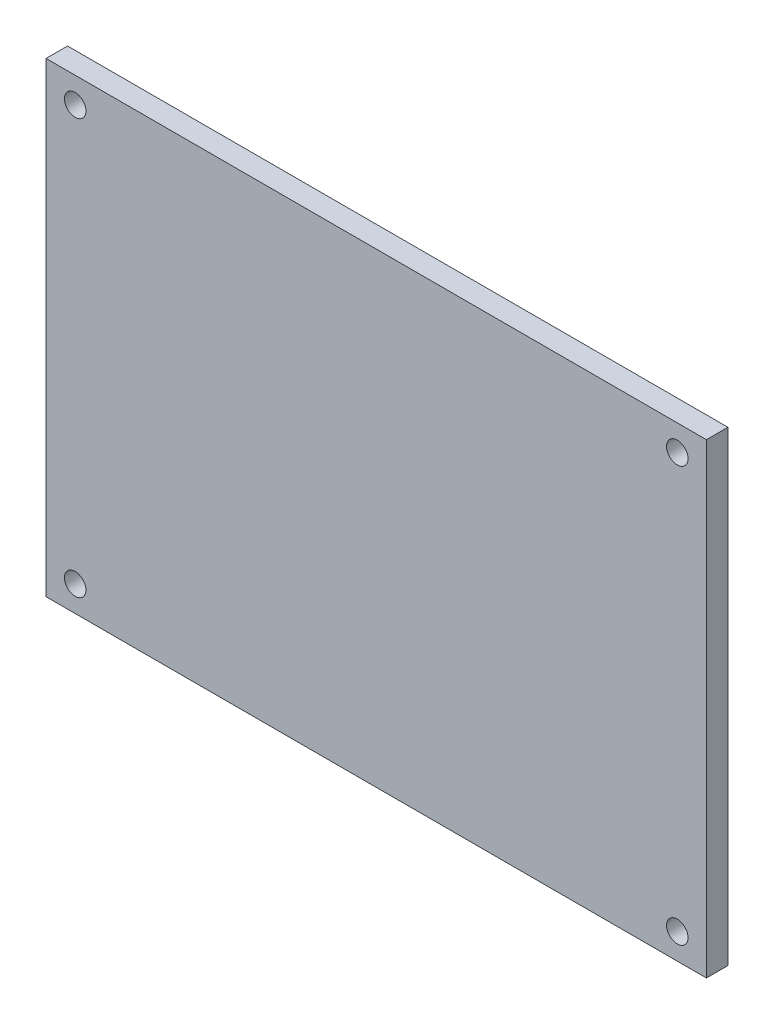
ISO-10303-21;
HEADER;
FILE_DESCRIPTION(('STEP AP214'),'2;1');
FILE_NAME('part.step','',(''),(''),'','','');
FILE_SCHEMA(('AUTOMOTIVE_DESIGN { 1 0 10303 214 1 1 1 1 }'));
ENDSEC;
DATA;
#1=APPLICATION_CONTEXT('core data for automotive mechanical design processes');
#2=APPLICATION_PROTOCOL_DEFINITION('international standard','automotive_design',2000,#1);
#3=PRODUCT_CONTEXT('',#1,'mechanical');
#4=PRODUCT('Part','Part','',(#3));
#5=PRODUCT_RELATED_PRODUCT_CATEGORY('part','',(#4));
#6=PRODUCT_DEFINITION_FORMATION('','',#4);
#7=PRODUCT_DEFINITION_CONTEXT('part definition',#1,'design');
#8=PRODUCT_DEFINITION('design','',#6,#7);
#9=PRODUCT_DEFINITION_SHAPE('','',#8);
#10=(LENGTH_UNIT() NAMED_UNIT(*) SI_UNIT(.MILLI.,.METRE.));
#11=(NAMED_UNIT(*) PLANE_ANGLE_UNIT() SI_UNIT($,.RADIAN.));
#12=(NAMED_UNIT(*) SI_UNIT($,.STERADIAN.) SOLID_ANGLE_UNIT());
#13=UNCERTAINTY_MEASURE_WITH_UNIT(LENGTH_MEASURE(1.E-05),#10,'distance_accuracy_value','');
#14=(GEOMETRIC_REPRESENTATION_CONTEXT(3) GLOBAL_UNCERTAINTY_ASSIGNED_CONTEXT((#13)) GLOBAL_UNIT_ASSIGNED_CONTEXT((#10,
#11,#12)) REPRESENTATION_CONTEXT('',''));
#15=CARTESIAN_POINT('',(0.,0.,0.));
#16=DIRECTION('',(0.,0.,1.));
#17=DIRECTION('',(1.,0.,0.));
#18=AXIS2_PLACEMENT_3D('',#15,#16,#17);
#19=CARTESIAN_POINT('',(0.,-32.5,3.));
#20=DIRECTION('',(0.,1.,0.));
#21=DIRECTION('',(0.,0.,1.));
#22=AXIS2_PLACEMENT_3D('',#19,#20,#21);
#23=PLANE('',#22);
#24=DIRECTION('',(1.,0.,0.));
#25=VECTOR('',#24,1.);
#26=CARTESIAN_POINT('',(0.,-32.5,0.));
#27=LINE('',#26,#25);
#28=CARTESIAN_POINT('',(-46.0375,-32.5,0.));
#29=VERTEX_POINT('',#28);
#30=CARTESIAN_POINT('',(46.0375,-32.5,0.));
#31=VERTEX_POINT('',#30);
#32=EDGE_CURVE('E113',#29,#31,#27,.T.);
#33=ORIENTED_EDGE('',*,*,#32,.T.);
#34=DIRECTION('',(0.,0.,-1.));
#35=VECTOR('',#34,1.);
#36=CARTESIAN_POINT('',(46.0375,-32.5,3.));
#37=LINE('',#36,#35);
#38=CARTESIAN_POINT('',(46.0375,-32.5,3.));
#39=VERTEX_POINT('',#38);
#40=EDGE_CURVE('E11',#39,#31,#37,.T.);
#41=ORIENTED_EDGE('',*,*,#40,.F.);
#42=DIRECTION('',(1.,0.,0.));
#43=VECTOR('',#42,1.);
#44=CARTESIAN_POINT('',(0.,-32.5,3.));
#45=LINE('',#44,#43);
#46=CARTESIAN_POINT('',(-46.0375,-32.5,3.));
#47=VERTEX_POINT('',#46);
#48=EDGE_CURVE('E87',#47,#39,#45,.T.);
#49=ORIENTED_EDGE('',*,*,#48,.F.);
#50=DIRECTION('',(0.,0.,-1.));
#51=VECTOR('',#50,1.);
#52=CARTESIAN_POINT('',(-46.0375,-32.5,3.));
#53=LINE('',#52,#51);
#54=EDGE_CURVE('E54',#47,#29,#53,.T.);
#55=ORIENTED_EDGE('',*,*,#54,.T.);
#56=EDGE_LOOP('',(#33,#41,#49,#55));
#57=FACE_BOUND('',#56,.T.);
#58=ADVANCED_FACE('F37',(#57),#23,.F.);
#59=CARTESIAN_POINT('',(46.0375,0.,3.));
#60=DIRECTION('',(-1.,0.,0.));
#61=DIRECTION('',(0.,0.,1.));
#62=AXIS2_PLACEMENT_3D('',#59,#60,#61);
#63=PLANE('',#62);
#64=DIRECTION('',(0.,1.,0.));
#65=VECTOR('',#64,1.);
#66=CARTESIAN_POINT('',(46.0375,0.,0.));
#67=LINE('',#66,#65);
#68=CARTESIAN_POINT('',(46.0375,32.5,0.));
#69=VERTEX_POINT('',#68);
#70=EDGE_CURVE('E92',#31,#69,#67,.T.);
#71=ORIENTED_EDGE('',*,*,#70,.T.);
#72=DIRECTION('',(0.,0.,-1.));
#73=VECTOR('',#72,1.);
#74=CARTESIAN_POINT('',(46.0375,32.5,3.));
#75=LINE('',#74,#73);
#76=CARTESIAN_POINT('',(46.0375,32.5,3.));
#77=VERTEX_POINT('',#76);
#78=EDGE_CURVE('E46',#77,#69,#75,.T.);
#79=ORIENTED_EDGE('',*,*,#78,.F.);
#80=DIRECTION('',(0.,1.,0.));
#81=VECTOR('',#80,1.);
#82=CARTESIAN_POINT('',(46.0375,0.,3.));
#83=LINE('',#82,#81);
#84=EDGE_CURVE('E79',#39,#77,#83,.T.);
#85=ORIENTED_EDGE('',*,*,#84,.F.);
#86=ORIENTED_EDGE('',*,*,#40,.T.);
#87=EDGE_LOOP('',(#71,#79,#85,#86));
#88=FACE_BOUND('',#87,.T.);
#89=ADVANCED_FACE('F91',(#88),#63,.F.);
#90=CARTESIAN_POINT('',(0.,32.5,3.));
#91=DIRECTION('',(0.,1.,0.));
#92=DIRECTION('',(0.,0.,1.));
#93=AXIS2_PLACEMENT_3D('',#90,#91,#92);
#94=PLANE('',#93);
#95=DIRECTION('',(1.,0.,0.));
#96=VECTOR('',#95,1.);
#97=CARTESIAN_POINT('',(0.,32.5,0.));
#98=LINE('',#97,#96);
#99=CARTESIAN_POINT('',(-46.0375,32.5,0.));
#100=VERTEX_POINT('',#99);
#101=EDGE_CURVE('E116',#100,#69,#98,.T.);
#102=ORIENTED_EDGE('',*,*,#101,.F.);
#103=DIRECTION('',(0.,0.,-1.));
#104=VECTOR('',#103,1.);
#105=CARTESIAN_POINT('',(-46.0375,32.5,3.));
#106=LINE('',#105,#104);
#107=CARTESIAN_POINT('',(-46.0375,32.5,3.));
#108=VERTEX_POINT('',#107);
#109=EDGE_CURVE('E68',#108,#100,#106,.T.);
#110=ORIENTED_EDGE('',*,*,#109,.F.);
#111=DIRECTION('',(1.,0.,0.));
#112=VECTOR('',#111,1.);
#113=CARTESIAN_POINT('',(0.,32.5,3.));
#114=LINE('',#113,#112);
#115=EDGE_CURVE('E86',#108,#77,#114,.T.);
#116=ORIENTED_EDGE('',*,*,#115,.T.);
#117=ORIENTED_EDGE('',*,*,#78,.T.);
#118=EDGE_LOOP('',(#102,#110,#116,#117));
#119=FACE_BOUND('',#118,.T.);
#120=ADVANCED_FACE('F95',(#119),#94,.T.);
#121=CARTESIAN_POINT('',(-41.9735,28.92,3.));
#122=DIRECTION('',(0.,0.,-1.));
#123=DIRECTION('',(-1.,0.,0.));
#124=AXIS2_PLACEMENT_3D('',#121,#122,#123);
#125=CYLINDRICAL_SURFACE('',#124,1.5);
#126=CARTESIAN_POINT('',(-41.9735,28.92,3.));
#127=DIRECTION('',(0.,0.,1.));
#128=DIRECTION('',(1.,0.,0.));
#129=AXIS2_PLACEMENT_3D('',#126,#127,#128);
#130=CIRCLE('',#129,1.5);
#131=CARTESIAN_POINT('',(-40.4735,28.92,3.));
#132=VERTEX_POINT('',#131);
#133=EDGE_CURVE('E135',#132,#132,#130,.T.);
#134=ORIENTED_EDGE('',*,*,#133,.T.);
#135=EDGE_LOOP('',(#134));
#136=FACE_BOUND('',#135,.T.);
#137=CARTESIAN_POINT('',(-41.9735,28.92,0.));
#138=DIRECTION('',(0.,0.,1.));
#139=DIRECTION('',(1.,0.,0.));
#140=AXIS2_PLACEMENT_3D('',#137,#138,#139);
#141=CIRCLE('',#140,1.5);
#142=CARTESIAN_POINT('',(-40.4735,28.92,0.));
#143=VERTEX_POINT('',#142);
#144=EDGE_CURVE('E110',#143,#143,#141,.T.);
#145=ORIENTED_EDGE('',*,*,#144,.F.);
#146=EDGE_LOOP('',(#145));
#147=FACE_BOUND('',#146,.T.);
#148=ADVANCED_FACE('F139',(#136,#147),#125,.F.);
#149=CARTESIAN_POINT('',(-41.9735,-28.92,3.));
#150=DIRECTION('',(0.,0.,-1.));
#151=DIRECTION('',(-1.,0.,0.));
#152=AXIS2_PLACEMENT_3D('',#149,#150,#151);
#153=CYLINDRICAL_SURFACE('',#152,1.5);
#154=CARTESIAN_POINT('',(-41.9735,-28.92,3.));
#155=DIRECTION('',(0.,0.,1.));
#156=DIRECTION('',(1.,0.,0.));
#157=AXIS2_PLACEMENT_3D('',#154,#155,#156);
#158=CIRCLE('',#157,1.5);
#159=CARTESIAN_POINT('',(-40.4735,-28.92,3.));
#160=VERTEX_POINT('',#159);
#161=EDGE_CURVE('E130',#160,#160,#158,.T.);
#162=ORIENTED_EDGE('',*,*,#161,.T.);
#163=EDGE_LOOP('',(#162));
#164=FACE_BOUND('',#163,.T.);
#165=CARTESIAN_POINT('',(-41.9735,-28.92,0.));
#166=DIRECTION('',(0.,0.,1.));
#167=DIRECTION('',(1.,0.,0.));
#168=AXIS2_PLACEMENT_3D('',#165,#166,#167);
#169=CIRCLE('',#168,1.5);
#170=CARTESIAN_POINT('',(-40.4735,-28.92,0.));
#171=VERTEX_POINT('',#170);
#172=EDGE_CURVE('E107',#171,#171,#169,.T.);
#173=ORIENTED_EDGE('',*,*,#172,.F.);
#174=EDGE_LOOP('',(#173));
#175=FACE_BOUND('',#174,.T.);
#176=ADVANCED_FACE('F165',(#164,#175),#153,.F.);
#177=CARTESIAN_POINT('',(41.9735,28.92,3.));
#178=DIRECTION('',(0.,0.,-1.));
#179=DIRECTION('',(-1.,0.,0.));
#180=AXIS2_PLACEMENT_3D('',#177,#178,#179);
#181=CYLINDRICAL_SURFACE('',#180,1.5);
#182=CARTESIAN_POINT('',(41.9735,28.92,3.));
#183=DIRECTION('',(0.,0.,1.));
#184=DIRECTION('',(1.,0.,0.));
#185=AXIS2_PLACEMENT_3D('',#182,#183,#184);
#186=CIRCLE('',#185,1.5);
#187=CARTESIAN_POINT('',(43.4735,28.92,3.));
#188=VERTEX_POINT('',#187);
#189=EDGE_CURVE('E125',#188,#188,#186,.T.);
#190=ORIENTED_EDGE('',*,*,#189,.T.);
#191=EDGE_LOOP('',(#190));
#192=FACE_BOUND('',#191,.T.);
#193=CARTESIAN_POINT('',(41.9735,28.92,0.));
#194=DIRECTION('',(0.,0.,1.));
#195=DIRECTION('',(1.,0.,0.));
#196=AXIS2_PLACEMENT_3D('',#193,#194,#195);
#197=CIRCLE('',#196,1.5);
#198=CARTESIAN_POINT('',(43.4735,28.92,0.));
#199=VERTEX_POINT('',#198);
#200=EDGE_CURVE('E104',#199,#199,#197,.T.);
#201=ORIENTED_EDGE('',*,*,#200,.F.);
#202=EDGE_LOOP('',(#201));
#203=FACE_BOUND('',#202,.T.);
#204=ADVANCED_FACE('F167',(#192,#203),#181,.F.);
#205=CARTESIAN_POINT('',(41.9735,-28.92,3.));
#206=DIRECTION('',(0.,0.,-1.));
#207=DIRECTION('',(-1.,0.,0.));
#208=AXIS2_PLACEMENT_3D('',#205,#206,#207);
#209=CYLINDRICAL_SURFACE('',#208,1.5);
#210=CARTESIAN_POINT('',(41.9735,-28.92,3.));
#211=DIRECTION('',(0.,0.,1.));
#212=DIRECTION('',(1.,0.,0.));
#213=AXIS2_PLACEMENT_3D('',#210,#211,#212);
#214=CIRCLE('',#213,1.5);
#215=CARTESIAN_POINT('',(43.4735,-28.92,3.));
#216=VERTEX_POINT('',#215);
#217=EDGE_CURVE('E121',#216,#216,#214,.T.);
#218=ORIENTED_EDGE('',*,*,#217,.T.);
#219=EDGE_LOOP('',(#218));
#220=FACE_BOUND('',#219,.T.);
#221=CARTESIAN_POINT('',(41.9735,-28.92,0.));
#222=DIRECTION('',(0.,0.,1.));
#223=DIRECTION('',(1.,0.,0.));
#224=AXIS2_PLACEMENT_3D('',#221,#222,#223);
#225=CIRCLE('',#224,1.5);
#226=CARTESIAN_POINT('',(43.4735,-28.92,0.));
#227=VERTEX_POINT('',#226);
#228=EDGE_CURVE('E101',#227,#227,#225,.T.);
#229=ORIENTED_EDGE('',*,*,#228,.F.);
#230=EDGE_LOOP('',(#229));
#231=FACE_BOUND('',#230,.T.);
#232=ADVANCED_FACE('F39',(#220,#231),#209,.F.);
#233=CARTESIAN_POINT('',(-46.0375,0.,3.));
#234=DIRECTION('',(-1.,0.,0.));
#235=DIRECTION('',(0.,0.,1.));
#236=AXIS2_PLACEMENT_3D('',#233,#234,#235);
#237=PLANE('',#236);
#238=DIRECTION('',(0.,1.,0.));
#239=VECTOR('',#238,1.);
#240=CARTESIAN_POINT('',(-46.0375,0.,0.));
#241=LINE('',#240,#239);
#242=EDGE_CURVE('E118',#29,#100,#241,.T.);
#243=ORIENTED_EDGE('',*,*,#242,.F.);
#244=ORIENTED_EDGE('',*,*,#54,.F.);
#245=DIRECTION('',(0.,1.,0.));
#246=VECTOR('',#245,1.);
#247=CARTESIAN_POINT('',(-46.0375,0.,3.));
#248=LINE('',#247,#246);
#249=EDGE_CURVE('E96',#47,#108,#248,.T.);
#250=ORIENTED_EDGE('',*,*,#249,.T.);
#251=ORIENTED_EDGE('',*,*,#109,.T.);
#252=EDGE_LOOP('',(#243,#244,#250,#251));
#253=FACE_BOUND('',#252,.T.);
#254=ADVANCED_FACE('F144',(#253),#237,.T.);
#255=CARTESIAN_POINT('',(0.,0.,3.));
#256=DIRECTION('',(0.,0.,1.));
#257=DIRECTION('',(1.,0.,0.));
#258=AXIS2_PLACEMENT_3D('',#255,#256,#257);
#259=PLANE('',#258);
#260=ORIENTED_EDGE('',*,*,#217,.F.);
#261=EDGE_LOOP('',(#260));
#262=FACE_BOUND('',#261,.T.);
#263=ORIENTED_EDGE('',*,*,#189,.F.);
#264=EDGE_LOOP('',(#263));
#265=FACE_BOUND('',#264,.T.);
#266=ORIENTED_EDGE('',*,*,#161,.F.);
#267=EDGE_LOOP('',(#266));
#268=FACE_BOUND('',#267,.T.);
#269=ORIENTED_EDGE('',*,*,#133,.F.);
#270=EDGE_LOOP('',(#269));
#271=FACE_BOUND('',#270,.T.);
#272=ORIENTED_EDGE('',*,*,#48,.T.);
#273=ORIENTED_EDGE('',*,*,#84,.T.);
#274=ORIENTED_EDGE('',*,*,#115,.F.);
#275=ORIENTED_EDGE('',*,*,#249,.F.);
#276=EDGE_LOOP('',(#272,#273,#274,#275));
#277=FACE_BOUND('',#276,.T.);
#278=ADVANCED_FACE('F83',(#262,#265,#268,#271,#277),#259,.T.);
#279=CARTESIAN_POINT('',(0.,0.,0.));
#280=DIRECTION('',(0.,0.,1.));
#281=DIRECTION('',(1.,0.,0.));
#282=AXIS2_PLACEMENT_3D('',#279,#280,#281);
#283=PLANE('',#282);
#284=ORIENTED_EDGE('',*,*,#228,.T.);
#285=EDGE_LOOP('',(#284));
#286=FACE_BOUND('',#285,.T.);
#287=ORIENTED_EDGE('',*,*,#200,.T.);
#288=EDGE_LOOP('',(#287));
#289=FACE_BOUND('',#288,.T.);
#290=ORIENTED_EDGE('',*,*,#172,.T.);
#291=EDGE_LOOP('',(#290));
#292=FACE_BOUND('',#291,.T.);
#293=ORIENTED_EDGE('',*,*,#144,.T.);
#294=EDGE_LOOP('',(#293));
#295=FACE_BOUND('',#294,.T.);
#296=ORIENTED_EDGE('',*,*,#32,.F.);
#297=ORIENTED_EDGE('',*,*,#242,.T.);
#298=ORIENTED_EDGE('',*,*,#101,.T.);
#299=ORIENTED_EDGE('',*,*,#70,.F.);
#300=EDGE_LOOP('',(#296,#297,#298,#299));
#301=FACE_BOUND('',#300,.T.);
#302=ADVANCED_FACE('F143',(#286,#289,#292,#295,#301),#283,.F.);
#303=CLOSED_SHELL('',(#58,#89,#120,#148,#176,#204,#232,#254,#278,#302));
#304=MANIFOLD_SOLID_BREP('B2',#303);
#305=ADVANCED_BREP_SHAPE_REPRESENTATION('',(#18,#304),#14);
#306=SHAPE_DEFINITION_REPRESENTATION(#9,#305);
ENDSEC;
END-ISO-10303-21;
